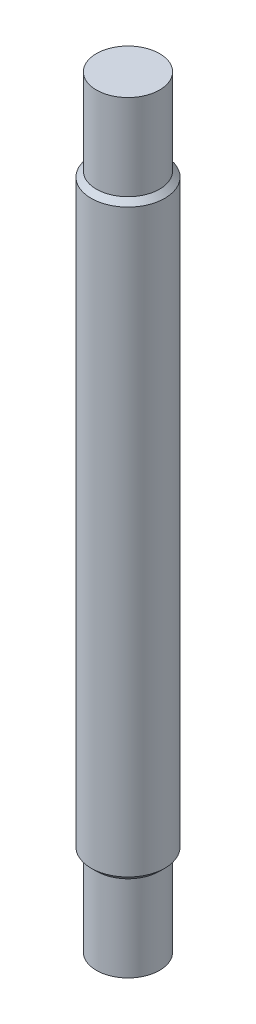
ISO-10303-21;
HEADER;
FILE_DESCRIPTION(('STEP AP214'),'2;1');
FILE_NAME('part.step','',(''),(''),'','','');
FILE_SCHEMA(('AUTOMOTIVE_DESIGN { 1 0 10303 214 1 1 1 1 }'));
ENDSEC;
DATA;
#1=APPLICATION_CONTEXT('core data for automotive mechanical design processes');
#2=APPLICATION_PROTOCOL_DEFINITION('international standard','automotive_design',2000,#1);
#3=PRODUCT_CONTEXT('',#1,'mechanical');
#4=PRODUCT('Part','Part','',(#3));
#5=PRODUCT_RELATED_PRODUCT_CATEGORY('part','',(#4));
#6=PRODUCT_DEFINITION_FORMATION('','',#4);
#7=PRODUCT_DEFINITION_CONTEXT('part definition',#1,'design');
#8=PRODUCT_DEFINITION('design','',#6,#7);
#9=PRODUCT_DEFINITION_SHAPE('','',#8);
#10=(LENGTH_UNIT() NAMED_UNIT(*) SI_UNIT(.MILLI.,.METRE.));
#11=(NAMED_UNIT(*) PLANE_ANGLE_UNIT() SI_UNIT($,.RADIAN.));
#12=(NAMED_UNIT(*) SI_UNIT($,.STERADIAN.) SOLID_ANGLE_UNIT());
#13=UNCERTAINTY_MEASURE_WITH_UNIT(LENGTH_MEASURE(1.E-05),#10,'distance_accuracy_value','');
#14=(GEOMETRIC_REPRESENTATION_CONTEXT(3) GLOBAL_UNCERTAINTY_ASSIGNED_CONTEXT((#13)) GLOBAL_UNIT_ASSIGNED_CONTEXT((#10,
#11,#12)) REPRESENTATION_CONTEXT('',''));
#15=CARTESIAN_POINT('',(0.,0.,0.));
#16=DIRECTION('',(0.,0.,1.));
#17=DIRECTION('',(1.,0.,0.));
#18=AXIS2_PLACEMENT_3D('',#15,#16,#17);
#19=CARTESIAN_POINT('',(0.,-230.,0.));
#20=DIRECTION('',(0.,1.,0.));
#21=DIRECTION('',(0.,0.,1.));
#22=AXIS2_PLACEMENT_3D('',#19,#20,#21);
#23=CYLINDRICAL_SURFACE('',#22,22.225);
#24=CARTESIAN_POINT('',(0.,-175.,0.));
#25=DIRECTION('',(0.,-1.,0.));
#26=DIRECTION('',(0.,0.,-1.));
#27=AXIS2_PLACEMENT_3D('',#24,#25,#26);
#28=CIRCLE('',#27,22.225);
#29=CARTESIAN_POINT('',(0.,-175.,-22.225));
#30=VERTEX_POINT('',#29);
#31=EDGE_CURVE('E48',#30,#30,#28,.F.);
#32=ORIENTED_EDGE('',*,*,#31,.T.);
#33=EDGE_LOOP('',(#32));
#34=FACE_BOUND('',#33,.T.);
#35=CARTESIAN_POINT('',(0.,175.,0.));
#36=DIRECTION('',(0.,1.,0.));
#37=DIRECTION('',(0.,0.,1.));
#38=AXIS2_PLACEMENT_3D('',#35,#36,#37);
#39=CIRCLE('',#38,22.225);
#40=CARTESIAN_POINT('',(0.,175.,22.225));
#41=VERTEX_POINT('',#40);
#42=EDGE_CURVE('E58',#41,#41,#39,.F.);
#43=ORIENTED_EDGE('',*,*,#42,.T.);
#44=EDGE_LOOP('',(#43));
#45=FACE_BOUND('',#44,.T.);
#46=ADVANCED_FACE('F39',(#34,#45),#23,.T.);
#47=CARTESIAN_POINT('',(0.,180.,0.));
#48=DIRECTION('',(0.,1.,0.));
#49=DIRECTION('',(0.,0.,1.));
#50=AXIS2_PLACEMENT_3D('',#47,#48,#49);
#51=CYLINDRICAL_SURFACE('',#50,19.05);
#52=CARTESIAN_POINT('',(0.,178.175,0.));
#53=DIRECTION('',(0.,-1.,0.));
#54=DIRECTION('',(0.,0.,-1.));
#55=AXIS2_PLACEMENT_3D('',#52,#53,#54);
#56=CIRCLE('',#55,19.05);
#57=CARTESIAN_POINT('',(0.,178.175,-19.05));
#58=VERTEX_POINT('',#57);
#59=EDGE_CURVE('E53',#58,#58,#56,.F.);
#60=ORIENTED_EDGE('',*,*,#59,.T.);
#61=EDGE_LOOP('',(#60));
#62=FACE_BOUND('',#61,.T.);
#63=CARTESIAN_POINT('',(0.,230.,0.));
#64=DIRECTION('',(0.,1.,0.));
#65=DIRECTION('',(0.,0.,1.));
#66=AXIS2_PLACEMENT_3D('',#63,#64,#65);
#67=CIRCLE('',#66,19.05);
#68=CARTESIAN_POINT('',(0.,230.,19.05));
#69=VERTEX_POINT('',#68);
#70=EDGE_CURVE('E64',#69,#69,#67,.T.);
#71=ORIENTED_EDGE('',*,*,#70,.F.);
#72=EDGE_LOOP('',(#71));
#73=FACE_BOUND('',#72,.T.);
#74=ADVANCED_FACE('F88',(#62,#73),#51,.T.);
#75=CARTESIAN_POINT('',(0.,230.,0.));
#76=DIRECTION('',(0.,1.,0.));
#77=DIRECTION('',(0.,0.,1.));
#78=AXIS2_PLACEMENT_3D('',#75,#76,#77);
#79=PLANE('',#78);
#80=ORIENTED_EDGE('',*,*,#70,.T.);
#81=EDGE_LOOP('',(#80));
#82=FACE_BOUND('',#81,.T.);
#83=ADVANCED_FACE('F84',(#82),#79,.T.);
#84=CARTESIAN_POINT('',(0.,175.,0.));
#85=DIRECTION('',(0.,-1.,0.));
#86=DIRECTION('',(0.,0.,-1.));
#87=AXIS2_PLACEMENT_3D('',#84,#85,#86);
#88=CONICAL_SURFACE('',#87,22.225,0.78539816339744);
#89=ORIENTED_EDGE('',*,*,#59,.F.);
#90=EDGE_LOOP('',(#89));
#91=FACE_BOUND('',#90,.T.);
#92=ORIENTED_EDGE('',*,*,#42,.F.);
#93=EDGE_LOOP('',(#92));
#94=FACE_BOUND('',#93,.T.);
#95=ADVANCED_FACE('F77',(#91,#94),#88,.T.);
#96=CARTESIAN_POINT('',(0.,-180.,0.));
#97=DIRECTION('',(0.,-1.,0.));
#98=DIRECTION('',(0.,0.,-1.));
#99=AXIS2_PLACEMENT_3D('',#96,#97,#98);
#100=CYLINDRICAL_SURFACE('',#99,19.05);
#101=CARTESIAN_POINT('',(0.,-178.175,0.));
#102=DIRECTION('',(0.,1.,0.));
#103=DIRECTION('',(0.,0.,1.));
#104=AXIS2_PLACEMENT_3D('',#101,#102,#103);
#105=CIRCLE('',#104,19.05);
#106=CARTESIAN_POINT('',(0.,-178.175,19.05));
#107=VERTEX_POINT('',#106);
#108=EDGE_CURVE('E10',#107,#107,#105,.F.);
#109=ORIENTED_EDGE('',*,*,#108,.T.);
#110=EDGE_LOOP('',(#109));
#111=FACE_BOUND('',#110,.T.);
#112=CARTESIAN_POINT('',(0.,-230.,0.));
#113=DIRECTION('',(0.,-1.,0.));
#114=DIRECTION('',(0.,0.,-1.));
#115=AXIS2_PLACEMENT_3D('',#112,#113,#114);
#116=CIRCLE('',#115,19.05);
#117=CARTESIAN_POINT('',(0.,-230.,-19.05));
#118=VERTEX_POINT('',#117);
#119=EDGE_CURVE('E68',#118,#118,#116,.T.);
#120=ORIENTED_EDGE('',*,*,#119,.F.);
#121=EDGE_LOOP('',(#120));
#122=FACE_BOUND('',#121,.T.);
#123=ADVANCED_FACE('F75',(#111,#122),#100,.T.);
#124=CARTESIAN_POINT('',(0.,-230.,0.));
#125=DIRECTION('',(0.,1.,0.));
#126=DIRECTION('',(0.,0.,1.));
#127=AXIS2_PLACEMENT_3D('',#124,#125,#126);
#128=PLANE('',#127);
#129=ORIENTED_EDGE('',*,*,#119,.T.);
#130=EDGE_LOOP('',(#129));
#131=FACE_BOUND('',#130,.T.);
#132=ADVANCED_FACE('F73',(#131),#128,.F.);
#133=CARTESIAN_POINT('',(0.,-175.,0.));
#134=DIRECTION('',(0.,1.,0.));
#135=DIRECTION('',(0.,0.,1.));
#136=AXIS2_PLACEMENT_3D('',#133,#134,#135);
#137=CONICAL_SURFACE('',#136,22.225,0.785398163397443);
#138=ORIENTED_EDGE('',*,*,#108,.F.);
#139=EDGE_LOOP('',(#138));
#140=FACE_BOUND('',#139,.T.);
#141=ORIENTED_EDGE('',*,*,#31,.F.);
#142=EDGE_LOOP('',(#141));
#143=FACE_BOUND('',#142,.T.);
#144=ADVANCED_FACE('F42',(#140,#143),#137,.T.);
#145=CLOSED_SHELL('',(#46,#74,#83,#95,#123,#132,#144));
#146=MANIFOLD_SOLID_BREP('B2',#145);
#147=ADVANCED_BREP_SHAPE_REPRESENTATION('',(#18,#146),#14);
#148=SHAPE_DEFINITION_REPRESENTATION(#9,#147);
ENDSEC;
END-ISO-10303-21;
